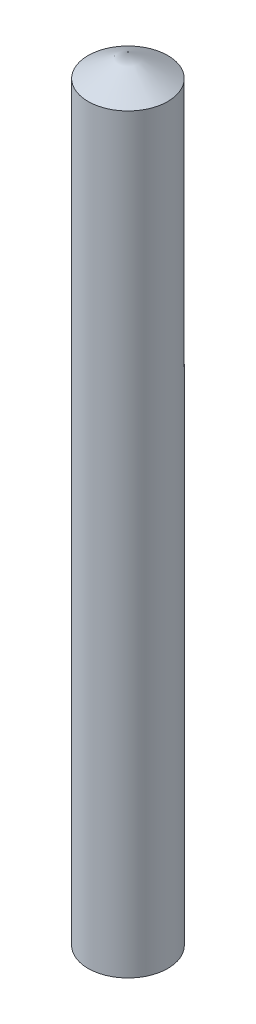
ISO-10303-21;
HEADER;
FILE_DESCRIPTION(('STEP AP214'),'2;1');
FILE_NAME('part.step','',(''),(''),'','','');
FILE_SCHEMA(('AUTOMOTIVE_DESIGN { 1 0 10303 214 1 1 1 1 }'));
ENDSEC;
DATA;
#1=APPLICATION_CONTEXT('core data for automotive mechanical design processes');
#2=APPLICATION_PROTOCOL_DEFINITION('international standard','automotive_design',2000,#1);
#3=PRODUCT_CONTEXT('',#1,'mechanical');
#4=PRODUCT('Part','Part','',(#3));
#5=PRODUCT_RELATED_PRODUCT_CATEGORY('part','',(#4));
#6=PRODUCT_DEFINITION_FORMATION('','',#4);
#7=PRODUCT_DEFINITION_CONTEXT('part definition',#1,'design');
#8=PRODUCT_DEFINITION('design','',#6,#7);
#9=PRODUCT_DEFINITION_SHAPE('','',#8);
#10=(LENGTH_UNIT() NAMED_UNIT(*) SI_UNIT(.MILLI.,.METRE.));
#11=(NAMED_UNIT(*) PLANE_ANGLE_UNIT() SI_UNIT($,.RADIAN.));
#12=(NAMED_UNIT(*) SI_UNIT($,.STERADIAN.) SOLID_ANGLE_UNIT());
#13=UNCERTAINTY_MEASURE_WITH_UNIT(LENGTH_MEASURE(1.E-05),#10,'distance_accuracy_value','');
#14=(GEOMETRIC_REPRESENTATION_CONTEXT(3) GLOBAL_UNCERTAINTY_ASSIGNED_CONTEXT((#13)) GLOBAL_UNIT_ASSIGNED_CONTEXT((#10,
#11,#12)) REPRESENTATION_CONTEXT('',''));
#15=CARTESIAN_POINT('',(0.,0.,0.));
#16=DIRECTION('',(0.,0.,1.));
#17=DIRECTION('',(1.,0.,0.));
#18=AXIS2_PLACEMENT_3D('',#15,#16,#17);
#19=CARTESIAN_POINT('',(0.,300.,0.));
#20=DIRECTION('',(0.,-1.,0.));
#21=DIRECTION('',(0.,0.,-1.));
#22=AXIS2_PLACEMENT_3D('',#19,#20,#21);
#23=CONICAL_SURFACE('',#22,0.,1.0471975511966);
#24=CARTESIAN_POINT('',(0.,282.679491924311,0.));
#25=DIRECTION('',(0.,1.,0.));
#26=DIRECTION('',(0.,0.,1.));
#27=AXIS2_PLACEMENT_3D('',#24,#25,#26);
#28=CIRCLE('',#27,30.);
#29=CARTESIAN_POINT('',(0.,282.679491924311,30.));
#30=VERTEX_POINT('',#29);
#31=EDGE_CURVE('E11',#30,#30,#28,.T.);
#32=ORIENTED_EDGE('',*,*,#31,.T.);
#33=EDGE_LOOP('',(#32));
#34=FACE_BOUND('',#33,.T.);
#35=CARTESIAN_POINT('',(0.,300.,0.));
#36=VERTEX_POINT('',#35);
#37=VERTEX_LOOP('',#36);
#38=FACE_BOUND('',#37,.T.);
#39=ADVANCED_FACE('F33',(#34,#38),#23,.T.);
#40=CARTESIAN_POINT('',(0.,321.806769230769,0.));
#41=DIRECTION('',(0.,1.,0.));
#42=DIRECTION('',(0.,0.,1.));
#43=AXIS2_PLACEMENT_3D('',#40,#41,#42);
#44=CYLINDRICAL_SURFACE('',#43,30.);
#45=CARTESIAN_POINT('',(0.,-282.679491924311,0.));
#46=DIRECTION('',(0.,1.,0.));
#47=DIRECTION('',(0.,0.,1.));
#48=AXIS2_PLACEMENT_3D('',#45,#46,#47);
#49=CIRCLE('',#48,29.9999999999999);
#50=CARTESIAN_POINT('',(0.,-282.679491924311,29.9999999999999));
#51=VERTEX_POINT('',#50);
#52=EDGE_CURVE('E40',#51,#51,#49,.T.);
#53=ORIENTED_EDGE('',*,*,#52,.T.);
#54=EDGE_LOOP('',(#53));
#55=FACE_BOUND('',#54,.T.);
#56=ORIENTED_EDGE('',*,*,#31,.F.);
#57=EDGE_LOOP('',(#56));
#58=FACE_BOUND('',#57,.T.);
#59=ADVANCED_FACE('F49',(#55,#58),#44,.T.);
#60=CARTESIAN_POINT('',(0.,-282.679491924311,0.));
#61=DIRECTION('',(0.,1.,0.));
#62=DIRECTION('',(0.,0.,1.));
#63=AXIS2_PLACEMENT_3D('',#60,#61,#62);
#64=CONICAL_SURFACE('',#63,29.9999999999999,1.0471975511966);
#65=CARTESIAN_POINT('',(0.,-300.,0.));
#66=VERTEX_POINT('',#65);
#67=VERTEX_LOOP('',#66);
#68=FACE_BOUND('',#67,.T.);
#69=ORIENTED_EDGE('',*,*,#52,.F.);
#70=EDGE_LOOP('',(#69));
#71=FACE_BOUND('',#70,.T.);
#72=ADVANCED_FACE('F46',(#68,#71),#64,.T.);
#73=CLOSED_SHELL('',(#39,#59,#72));
#74=MANIFOLD_SOLID_BREP('B2',#73);
#75=ADVANCED_BREP_SHAPE_REPRESENTATION('',(#18,#74),#14);
#76=SHAPE_DEFINITION_REPRESENTATION(#9,#75);
ENDSEC;
END-ISO-10303-21;
